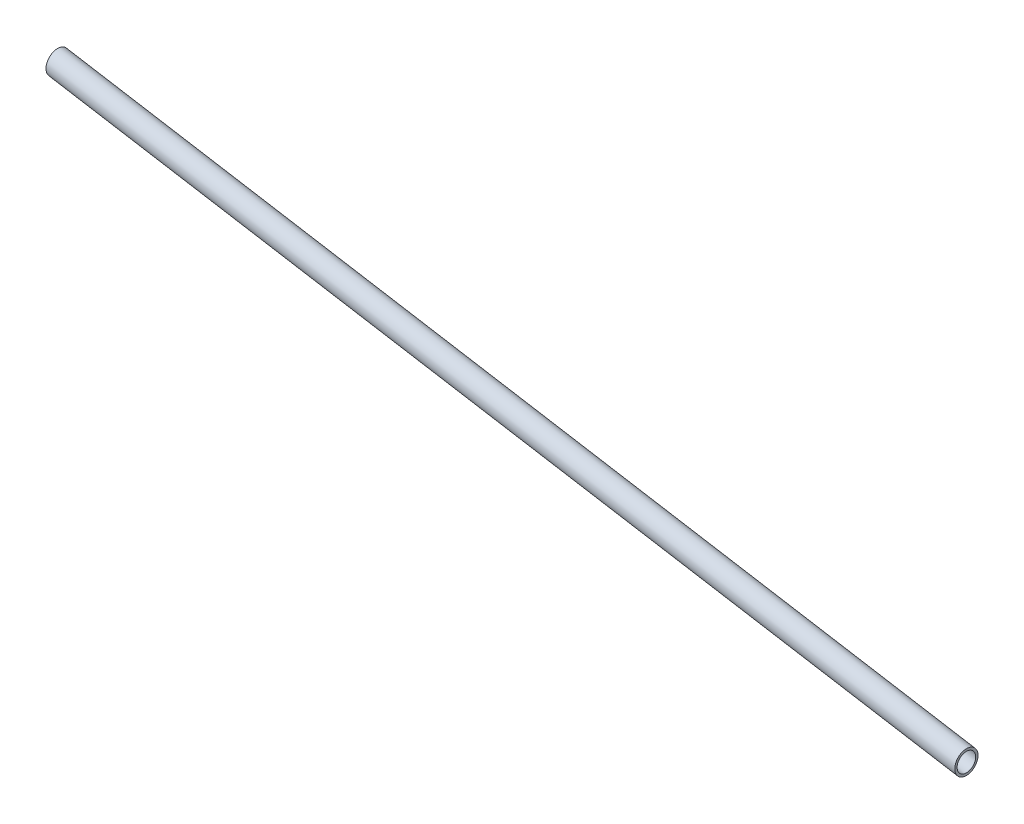
ISO-10303-21;
HEADER;
FILE_DESCRIPTION(('STEP AP214'),'2;1');
FILE_NAME('part.step','',(''),(''),'','','');
FILE_SCHEMA(('AUTOMOTIVE_DESIGN { 1 0 10303 214 1 1 1 1 }'));
ENDSEC;
DATA;
#1=APPLICATION_CONTEXT('core data for automotive mechanical design processes');
#2=APPLICATION_PROTOCOL_DEFINITION('international standard','automotive_design',2000,#1);
#3=PRODUCT_CONTEXT('',#1,'mechanical');
#4=PRODUCT('Part','Part','',(#3));
#5=PRODUCT_RELATED_PRODUCT_CATEGORY('part','',(#4));
#6=PRODUCT_DEFINITION_FORMATION('','',#4);
#7=PRODUCT_DEFINITION_CONTEXT('part definition',#1,'design');
#8=PRODUCT_DEFINITION('design','',#6,#7);
#9=PRODUCT_DEFINITION_SHAPE('','',#8);
#10=(LENGTH_UNIT() NAMED_UNIT(*) SI_UNIT(.MILLI.,.METRE.));
#11=(NAMED_UNIT(*) PLANE_ANGLE_UNIT() SI_UNIT($,.RADIAN.));
#12=(NAMED_UNIT(*) SI_UNIT($,.STERADIAN.) SOLID_ANGLE_UNIT());
#13=UNCERTAINTY_MEASURE_WITH_UNIT(LENGTH_MEASURE(1.E-05),#10,'distance_accuracy_value','');
#14=(GEOMETRIC_REPRESENTATION_CONTEXT(3) GLOBAL_UNCERTAINTY_ASSIGNED_CONTEXT((#13)) GLOBAL_UNIT_ASSIGNED_CONTEXT((#10,
#11,#12)) REPRESENTATION_CONTEXT('',''));
#15=CARTESIAN_POINT('',(0.,0.,0.));
#16=DIRECTION('',(0.,0.,1.));
#17=DIRECTION('',(1.,0.,0.));
#18=AXIS2_PLACEMENT_3D('',#15,#16,#17);
#19=CARTESIAN_POINT('',(900.,-13.3527483768346,117.528566468452));
#20=DIRECTION('',(1.,0.,0.));
#21=DIRECTION('',(0.,0.,1.));
#22=AXIS2_PLACEMENT_3D('',#19,#20,#21);
#23=PLANE('',#22);
#24=CARTESIAN_POINT('',(900.,-13.6611981228931,125.522617929017));
#25=CARTESIAN_POINT('',(899.999999999999,-14.3273690779402,125.496913783512));
#26=CARTESIAN_POINT('',(900.,-15.077816038196,125.386830865983));
#27=CARTESIAN_POINT('',(900.,-16.2918837939154,124.981319479555));
#28=CARTESIAN_POINT('',(900.,-16.7105159653835,124.805600335317));
#29=CARTESIAN_POINT('',(900.,-17.5555198140543,124.352534326282));
#30=CARTESIAN_POINT('',(899.999999999999,-17.9819276286325,124.074950500815));
#31=CARTESIAN_POINT('',(900.,-18.809950471408,123.402525077723));
#32=CARTESIAN_POINT('',(900.,-19.2114321716608,123.007383410496));
#33=CARTESIAN_POINT('',(900.,-19.9455280927444,122.097687446241));
#34=CARTESIAN_POINT('',(900.,-20.277770524181,121.582917586888));
#35=CARTESIAN_POINT('',(900.,-20.825181509128,120.453705408092));
#36=CARTESIAN_POINT('',(900.,-21.0398273173365,119.839343780789));
#37=CARTESIAN_POINT('',(900.,-21.3136829117945,118.555404213572));
#38=CARTESIAN_POINT('',(900.,-21.3725039829041,117.886287677441));
#39=CARTESIAN_POINT('',(900.,-21.3210956918944,116.553945767347));
#40=CARTESIAN_POINT('',(900.,-21.2108906650607,115.891351087779));
#41=CARTESIAN_POINT('',(900.,-20.8389151987204,114.632330853103));
#42=CARTESIAN_POINT('',(900.,-20.5775678721537,114.036335377466));
#43=CARTESIAN_POINT('',(900.,-19.9447728744568,112.952661338804));
#44=CARTESIAN_POINT('',(900.,-19.573852612162,112.465022947816));
#45=CARTESIAN_POINT('',(900.,-18.7718425667194,111.614597492093));
#46=CARTESIAN_POINT('',(900.,-18.341106857399,111.251566857665));
#47=CARTESIAN_POINT('',(900.,-17.4637320552541,110.644944047066));
#48=CARTESIAN_POINT('',(900.,-17.0172027720756,110.40104241985));
#49=CARTESIAN_POINT('',(899.999999999999,-16.1398002125449,110.014435304887));
#50=CARTESIAN_POINT('',(900.,-15.7088726472318,109.87149634556));
#51=CARTESIAN_POINT('',(899.999999999999,-14.4671677942657,109.560740721121));
#52=CARTESIAN_POINT('',(900.,-13.7104695858231,109.508810862383));
#53=CARTESIAN_POINT('',(899.999999999999,-12.3781276757289,109.560219153392));
#54=CARTESIAN_POINT('',(900.,-11.6276807154731,109.670302070921));
#55=CARTESIAN_POINT('',(900.,-10.4136129597538,110.075813457349));
#56=CARTESIAN_POINT('',(900.,-9.99498078828561,110.251532601588));
#57=CARTESIAN_POINT('',(899.999999999999,-9.1499769396148,110.704598610623));
#58=CARTESIAN_POINT('',(900.,-8.72356912503667,110.98218243609));
#59=CARTESIAN_POINT('',(899.999999999999,-7.89554628226113,111.654607859181));
#60=CARTESIAN_POINT('',(899.999999999999,-7.49406458200832,112.049749526409));
#61=CARTESIAN_POINT('',(900.,-6.75996866092468,112.959445490663));
#62=CARTESIAN_POINT('',(900.,-6.42772622948817,113.474215350017));
#63=CARTESIAN_POINT('',(899.999999999999,-5.88031524454111,114.603427528812));
#64=CARTESIAN_POINT('',(900.,-5.66566943633261,115.217789156115));
#65=CARTESIAN_POINT('',(900.,-5.39181384187462,116.501728723333));
#66=CARTESIAN_POINT('',(900.,-5.33299277076501,117.170845259464));
#67=CARTESIAN_POINT('',(900.,-5.38440106177477,118.503187169558));
#68=CARTESIAN_POINT('',(900.,-5.49460608860846,119.165781849125));
#69=CARTESIAN_POINT('',(900.,-5.86658155494875,120.424802083801));
#70=CARTESIAN_POINT('',(900.,-6.12792888151546,121.020797559439));
#71=CARTESIAN_POINT('',(900.,-6.76072387921231,122.104471598101));
#72=CARTESIAN_POINT('',(900.,-7.13164414150718,122.592109989088));
#73=CARTESIAN_POINT('',(900.,-7.93365418694975,123.442535444812));
#74=CARTESIAN_POINT('',(899.999999999999,-8.36438989627016,123.80556607924));
#75=CARTESIAN_POINT('',(900.,-9.24176469841508,124.412188889839));
#76=CARTESIAN_POINT('',(899.999999999999,-9.68829398159356,124.656090517054));
#77=CARTESIAN_POINT('',(899.999999999999,-10.5656965411242,125.042697632018));
#78=CARTESIAN_POINT('',(900.,-10.9966241064373,125.185636591345));
#79=CARTESIAN_POINT('',(900.,-12.2383289594035,125.496392215783));
#80=CARTESIAN_POINT('',(900.,-12.9950271678461,125.548322074522));
#81=CARTESIAN_POINT('',(900.,-13.6611981228931,125.522617929017));
#82=B_SPLINE_CURVE_WITH_KNOTS('',3,(#24,#25,#26,#27,#28,#29,#30,#31,#32,#33,#34,#35,#36,#37,#38,
#39,#40,#41,#42,#43,#44,#45,#46,#47,#48,#49,#50,#51,#52,#53,#54,#55,#56,#57,#58,#59,#60,#61,#62,
#63,#64,#65,#66,#67,#68,#69,#70,#71,#72,#73,#74,#75,#76,#77,#78,#79,#80,#81),.UNSPECIFIED.,.T.,
.F.,(4,2,2,2,2,2,2,2,2,2,2,2,2,2,2,2,2,2,2,2,2,2,2,2,2,2,2,2,4),(0.,0.0624999999999998,
0.0937499999999998,0.125,0.15625,0.1875,0.21875,0.25,0.28125,0.3125,0.34375,0.374999999999999,
0.406249999999999,0.437499999999999,0.499999999999999,0.562499999999999,0.593749999999999,
0.624999999999999,0.656249999999999,0.687499999999999,0.71875,0.75,0.78125,0.8125,0.84375,0.875,
0.90625,0.9375,1.),.UNSPECIFIED.);
#83=CARTESIAN_POINT('',(900.,-13.6611981228931,125.522617929017));
#84=VERTEX_POINT('',#83);
#85=EDGE_CURVE('E53',#84,#84,#82,.F.);
#86=ORIENTED_EDGE('',*,*,#85,.T.);
#87=EDGE_LOOP('',(#86));
#88=FACE_BOUND('',#87,.T.);
#89=CARTESIAN_POINT('',(900.,-13.3527483768346,127.528566468452));
#90=CARTESIAN_POINT('',(900.,-12.9360817101679,127.528566468452));
#91=CARTESIAN_POINT('',(900.,-12.4931143673846,127.502722627901));
#92=CARTESIAN_POINT('',(900.,-11.5575151296474,127.377419158561));
#93=CARTESIAN_POINT('',(900.,-11.0647483768346,127.277899801786));
#94=CARTESIAN_POINT('',(900.,-10.0407483768346,126.979233135119));
#95=CARTESIAN_POINT('',(900.,-9.50937843196229,126.779923620327));
#96=CARTESIAN_POINT('',(899.999999999999,-8.43207337788663,126.254737406465));
#97=CARTESIAN_POINT('',(900.,-7.8860817101679,125.928566468452));
#98=CARTESIAN_POINT('',(899.999999999999,-6.81941504350124,125.128566468452));
#99=CARTESIAN_POINT('',(900.,-6.29889211862478,124.654356172587));
#100=CARTESIAN_POINT('',(899.999999999999,-5.33811148435944,123.553461695824));
#101=CARTESIAN_POINT('',(900.,-4.89830777706525,122.926490343885));
#102=CARTESIAN_POINT('',(899.999999999999,-4.16013015307448,121.542407298902));
#103=CARTESIAN_POINT('',(900.,-3.86241307111466,120.78537120218));
#104=CARTESIAN_POINT('',(900.,-3.45846829793911,119.194838657801));
#105=CARTESIAN_POINT('',(900.,-3.35274837683457,118.361899801786));
#106=CARTESIAN_POINT('',(900.,-3.35274837683457,116.695233135119));
#107=CARTESIAN_POINT('',(900.,-3.45846829793911,115.862294279103));
#108=CARTESIAN_POINT('',(900.,-3.86241307111466,114.271761734724));
#109=CARTESIAN_POINT('',(900.,-4.16013015307448,113.514725638003));
#110=CARTESIAN_POINT('',(899.999999999999,-4.89830777706525,112.13064259302));
#111=CARTESIAN_POINT('',(900.,-5.33811148435943,111.50367124108));
#112=CARTESIAN_POINT('',(900.,-6.29889211862478,110.402776764318));
#113=CARTESIAN_POINT('',(900.,-6.81941504350124,109.928566468452));
#114=CARTESIAN_POINT('',(899.999999999999,-7.8860817101679,109.128566468452));
#115=CARTESIAN_POINT('',(900.,-8.43207337788662,108.802395530439));
#116=CARTESIAN_POINT('',(899.999999999999,-9.50937843196229,108.277209316577));
#117=CARTESIAN_POINT('',(900.,-10.0407483768346,108.077899801786));
#118=CARTESIAN_POINT('',(900.,-11.0647483768346,107.779233135119));
#119=CARTESIAN_POINT('',(900.,-11.5575151296474,107.679713778343));
#120=CARTESIAN_POINT('',(899.999999999999,-12.4931143673846,107.554410309004));
#121=CARTESIAN_POINT('',(900.,-12.9360817101679,107.528566468452));
#122=CARTESIAN_POINT('',(900.,-13.7694150435012,107.528566468452));
#123=CARTESIAN_POINT('',(900.,-14.2123823862845,107.554410309004));
#124=CARTESIAN_POINT('',(900.,-15.1479816240218,107.679713778343));
#125=CARTESIAN_POINT('',(900.,-15.6407483768346,107.779233135119));
#126=CARTESIAN_POINT('',(900.,-16.6647483768346,108.077899801786));
#127=CARTESIAN_POINT('',(899.999999999999,-17.1961183217068,108.277209316577));
#128=CARTESIAN_POINT('',(900.,-18.2734233757825,108.802395530439));
#129=CARTESIAN_POINT('',(900.,-18.8194150435012,109.128566468452));
#130=CARTESIAN_POINT('',(900.,-19.8860817101679,109.928566468452));
#131=CARTESIAN_POINT('',(900.,-20.4066046350444,110.402776764318));
#132=CARTESIAN_POINT('',(900.,-21.3673852693097,111.50367124108));
#133=CARTESIAN_POINT('',(900.,-21.8071889766039,112.13064259302));
#134=CARTESIAN_POINT('',(900.,-22.5453666005947,113.514725638002));
#135=CARTESIAN_POINT('',(899.999999999999,-22.8430836825545,114.271761734724));
#136=CARTESIAN_POINT('',(899.999999999999,-23.24702845573,115.862294279103));
#137=CARTESIAN_POINT('',(900.,-23.3527483768346,116.695233135119));
#138=CARTESIAN_POINT('',(900.,-23.3527483768345,118.361899801786));
#139=CARTESIAN_POINT('',(900.,-23.24702845573,119.194838657801));
#140=CARTESIAN_POINT('',(900.,-22.8430836825545,120.78537120218));
#141=CARTESIAN_POINT('',(899.999999999999,-22.5453666005947,121.542407298902));
#142=CARTESIAN_POINT('',(900.,-21.8071889766039,122.926490343885));
#143=CARTESIAN_POINT('',(900.,-21.3673852693097,123.553461695825));
#144=CARTESIAN_POINT('',(900.,-20.4066046350444,124.654356172587));
#145=CARTESIAN_POINT('',(900.,-19.8860817101679,125.128566468452));
#146=CARTESIAN_POINT('',(900.,-18.8194150435012,125.928566468452));
#147=CARTESIAN_POINT('',(900.,-18.2734233757825,126.254737406465));
#148=CARTESIAN_POINT('',(900.,-17.1961183217068,126.779923620327));
#149=CARTESIAN_POINT('',(900.000000000001,-16.6647483768346,126.979233135119));
#150=CARTESIAN_POINT('',(900.,-15.6407483768346,127.277899801786));
#151=CARTESIAN_POINT('',(900.,-15.1479816240218,127.377419158561));
#152=CARTESIAN_POINT('',(900.,-14.2123823862845,127.502722627901));
#153=CARTESIAN_POINT('',(900.,-13.7694150435012,127.528566468452));
#154=CARTESIAN_POINT('',(900.,-13.3527483768346,127.528566468452));
#155=B_SPLINE_CURVE_WITH_KNOTS('',3,(#89,#90,#91,#92,#93,#94,#95,#96,#97,#98,#99,#100,#101,#102,
#103,#104,#105,#106,#107,#108,#109,#110,#111,#112,#113,#114,#115,#116,#117,#118,#119,#120,#121,
#122,#123,#124,#125,#126,#127,#128,#129,#130,#131,#132,#133,#134,#135,#136,#137,#138,#139,#140,
#141,#142,#143,#144,#145,#146,#147,#148,#149,#150,#151,#152,#153,#154),.UNSPECIFIED.,.T.,.F.,(4,
2,2,2,2,2,2,2,2,2,2,2,2,2,2,2,2,2,2,2,2,2,2,2,2,2,2,2,2,2,2,2,4),(0.,0.03125,0.0625,0.09375,
0.125,0.15625,0.1875,0.21875,0.25,0.28125,0.3125,0.34375,0.375,0.40625,0.4375,0.46875,0.5,
0.53125,0.5625,0.59375,0.625,0.65625,0.6875,0.71875,0.75,0.78125,0.8125,0.84375,0.875,0.90625,
0.9375,0.96875,1.),.UNSPECIFIED.);
#156=CARTESIAN_POINT('',(900.,-13.3527483768346,127.528566468452));
#157=VERTEX_POINT('',#156);
#158=EDGE_CURVE('E10',#157,#157,#155,.T.);
#159=ORIENTED_EDGE('',*,*,#158,.F.);
#160=EDGE_LOOP('',(#159));
#161=FACE_BOUND('',#160,.T.);
#162=ADVANCED_FACE('F39',(#88,#161),#23,.T.);
#163=CARTESIAN_POINT('',(0.,0.,0.));
#164=DIRECTION('',(1.,0.,0.));
#165=DIRECTION('',(0.,0.,1.));
#166=AXIS2_PLACEMENT_3D('',#163,#164,#165);
#167=PLANE('',#166);
#168=CARTESIAN_POINT('',(0.,0.04684620258965,7.9998628384056));
#169=CARTESIAN_POINT('',(0.,0.71350143912345,7.9959589881898));
#170=CARTESIAN_POINT('',(0.,1.46714713450424,7.91047767606317));
#171=CARTESIAN_POINT('',(0.,2.69382735660733,7.54488824418483));
#172=CARTESIAN_POINT('',(0.,3.11798233475947,7.38295409970364));
#173=CARTESIAN_POINT('',(0.,3.97735130355492,6.95776556707056));
#174=CARTESIAN_POINT('',(0.,4.41260916183703,6.69427552684503));
#175=CARTESIAN_POINT('',(0.,5.26218016839313,6.04928957149636));
#176=CARTESIAN_POINT('',(0.,5.67636987355985,5.66748938690894));
#177=CARTESIAN_POINT('',(0.,6.43982393018292,4.78228801311951));
#178=CARTESIAN_POINT('',(0.,6.78872374090341,4.27865921784961));
#179=CARTESIAN_POINT('',(0.,7.37277181166143,3.16795368431511));
#180=CARTESIAN_POINT('',(0.,7.60739496705886,2.56094049909171));
#181=CARTESIAN_POINT('',(0.,7.92309420404844,1.2866439517188));
#182=CARTESIAN_POINT('',(0.,8.00376668862141,0.619809033944151));
#183=CARTESIAN_POINT('',(0.,7.99595898818979,-0.71350143912345));
#184=CARTESIAN_POINT('',(0.,7.90748249913809,-1.37934584152974));
#185=CARTESIAN_POINT('',(0.,7.57688118018863,-2.6498577331668));
#186=CARTESIAN_POINT('',(0.,7.33516517152026,-3.25408153544302));
#187=CARTESIAN_POINT('',(0.,6.73814929381701,-4.3578709052734));
#188=CARTESIAN_POINT('',(0.,6.38337523770235,-4.85737907382898));
#189=CARTESIAN_POINT('',(0.,5.60960663594162,-5.73357866277101));
#190=CARTESIAN_POINT('',(0.,5.19097394045686,-6.11050194288017));
#191=CARTESIAN_POINT('',(0.,4.33390754148642,-6.74549404167638));
#192=CARTESIAN_POINT('',(0.,3.89559370923611,-7.00386855464627));
#193=CARTESIAN_POINT('',(0.,3.03130414448628,-7.41896355711653));
#194=CARTESIAN_POINT('',(0.,2.60528178755254,-7.57591916878022));
#195=CARTESIAN_POINT('',(0.,1.37440414569743,-7.92711744722302));
#196=CARTESIAN_POINT('',(0.,0.619809033944149,-8.00376668862141));
#197=CARTESIAN_POINT('',(0.,-0.713501439123451,-7.9959589881898));
#198=CARTESIAN_POINT('',(0.,-1.46714713450424,-7.91047767606317));
#199=CARTESIAN_POINT('',(0.,-2.69382735660733,-7.54488824418483));
#200=CARTESIAN_POINT('',(0.,-3.11798233475947,-7.38295409970363));
#201=CARTESIAN_POINT('',(0.,-3.97735130355492,-6.95776556707056));
#202=CARTESIAN_POINT('',(0.,-4.41260916183704,-6.69427552684504));
#203=CARTESIAN_POINT('',(0.,-5.26218016839313,-6.04928957149635));
#204=CARTESIAN_POINT('',(0.,-5.67636987355985,-5.66748938690893));
#205=CARTESIAN_POINT('',(0.,-6.43982393018293,-4.78228801311951));
#206=CARTESIAN_POINT('',(0.,-6.78872374090342,-4.27865921784961));
#207=CARTESIAN_POINT('',(0.,-7.37277181166143,-3.16795368431511));
#208=CARTESIAN_POINT('',(0.,-7.60739496705886,-2.56094049909171));
#209=CARTESIAN_POINT('',(0.,-7.92309420404844,-1.2866439517188));
#210=CARTESIAN_POINT('',(0.,-8.00376668862141,-0.619809033944147));
#211=CARTESIAN_POINT('',(0.,-7.9959589881898,0.71350143912345));
#212=CARTESIAN_POINT('',(0.,-7.90748249913809,1.37934584152974));
#213=CARTESIAN_POINT('',(0.,-7.57688118018863,2.6498577331668));
#214=CARTESIAN_POINT('',(0.,-7.33516517152026,3.25408153544302));
#215=CARTESIAN_POINT('',(0.,-6.73814929381701,4.3578709052734));
#216=CARTESIAN_POINT('',(0.,-6.38337523770235,4.85737907382898));
#217=CARTESIAN_POINT('',(0.,-5.60960663594162,5.73357866277101));
#218=CARTESIAN_POINT('',(0.,-5.19097394045686,6.11050194288017));
#219=CARTESIAN_POINT('',(0.,-4.33390754148642,6.74549404167638));
#220=CARTESIAN_POINT('',(0.,-3.89559370923611,7.00386855464627));
#221=CARTESIAN_POINT('',(0.,-3.03130414448628,7.41896355711653));
#222=CARTESIAN_POINT('',(0.,-2.60528178755255,7.57591916878021));
#223=CARTESIAN_POINT('',(0.,-1.37440414569742,7.92711744722302));
#224=CARTESIAN_POINT('',(0.,-0.619809033944146,8.0037666886214));
#225=CARTESIAN_POINT('',(0.,0.0468462025896497,7.9998628384056));
#226=B_SPLINE_CURVE_WITH_KNOTS('',3,(#168,#169,#170,#171,#172,#173,#174,#175,#176,#177,#178,
#179,#180,#181,#182,#183,#184,#185,#186,#187,#188,#189,#190,#191,#192,#193,#194,#195,#196,#197,
#198,#199,#200,#201,#202,#203,#204,#205,#206,#207,#208,#209,#210,#211,#212,#213,#214,#215,#216,
#217,#218,#219,#220,#221,#222,#223,#224,#225),.UNSPECIFIED.,.T.,.F.,(4,2,2,2,2,2,2,2,2,2,2,2,2,
2,2,2,2,2,2,2,2,2,2,2,2,2,2,2,4),(0.,0.0625000000000002,0.0937500000000002,0.125,0.15625,0.1875,
0.21875,0.25,0.28125,0.312500000000001,0.343750000000001,0.375000000000001,0.406250000000001,
0.437500000000001,0.500000000000001,0.562500000000001,0.593750000000001,0.625000000000001,
0.65625,0.6875,0.71875,0.75,0.78125,0.8125,0.84375,0.875,0.90625,0.9375,1.),.UNSPECIFIED.);
#227=CARTESIAN_POINT('',(0.,0.04684620258965,7.9998628384056));
#228=VERTEX_POINT('',#227);
#229=EDGE_CURVE('E58',#228,#228,#226,.F.);
#230=ORIENTED_EDGE('',*,*,#229,.T.);
#231=EDGE_LOOP('',(#230));
#232=FACE_BOUND('',#231,.T.);
#233=CARTESIAN_POINT('',(0.,0.,10.));
#234=CARTESIAN_POINT('',(0.,-0.416666666666666,10.));
#235=CARTESIAN_POINT('',(0.,-0.85963400944997,9.97415615944867));
#236=CARTESIAN_POINT('',(0.,-1.7952332471872,9.84885269010886));
#237=CARTESIAN_POINT('',(0.,-2.288,9.74933333333334));
#238=CARTESIAN_POINT('',(0.,-3.312,9.45066666666666));
#239=CARTESIAN_POINT('',(0.,-3.84336994487228,9.25135715187476));
#240=CARTESIAN_POINT('',(0.,-4.92067499894794,8.72617093801288));
#241=CARTESIAN_POINT('',(0.,-5.46666666666667,8.4));
#242=CARTESIAN_POINT('',(0.,-6.53333333333333,7.6));
#243=CARTESIAN_POINT('',(0.,-7.05385625820979,7.12578970413461));
#244=CARTESIAN_POINT('',(0.,-8.01463689247514,6.02489522737224));
#245=CARTESIAN_POINT('',(0.,-8.45444059976932,5.39792387543252));
#246=CARTESIAN_POINT('',(0.,-9.19261822376009,4.01384083044983));
#247=CARTESIAN_POINT('',(0.,-9.49033530571992,3.25680473372781));
#248=CARTESIAN_POINT('',(0.,-9.89428007889547,1.66627218934911));
#249=CARTESIAN_POINT('',(0.,-10.,0.833333333333334));
#250=CARTESIAN_POINT('',(0.,-10.,-0.833333333333333));
#251=CARTESIAN_POINT('',(0.,-9.89428007889546,-1.66627218934911));
#252=CARTESIAN_POINT('',(0.,-9.49033530571992,-3.25680473372781));
#253=CARTESIAN_POINT('',(0.,-9.19261822376009,-4.01384083044983));
#254=CARTESIAN_POINT('',(0.,-8.45444059976932,-5.39792387543253));
#255=CARTESIAN_POINT('',(0.,-8.01463689247514,-6.02489522737224));
#256=CARTESIAN_POINT('',(0.,-7.05385625820979,-7.12578970413462));
#257=CARTESIAN_POINT('',(0.,-6.53333333333333,-7.6));
#258=CARTESIAN_POINT('',(0.,-5.46666666666667,-8.4));
#259=CARTESIAN_POINT('',(0.,-4.92067499894794,-8.72617093801288));
#260=CARTESIAN_POINT('',(0.,-3.84336994487228,-9.25135715187477));
#261=CARTESIAN_POINT('',(0.,-3.312,-9.45066666666667));
#262=CARTESIAN_POINT('',(0.,-2.288,-9.74933333333334));
#263=CARTESIAN_POINT('',(0.,-1.7952332471872,-9.84885269010886));
#264=CARTESIAN_POINT('',(0.,-0.859634009449969,-9.97415615944867));
#265=CARTESIAN_POINT('',(0.,-0.416666666666665,-10.));
#266=CARTESIAN_POINT('',(0.,0.416666666666668,-10.));
#267=CARTESIAN_POINT('',(0.,0.859634009449971,-9.97415615944867));
#268=CARTESIAN_POINT('',(0.,1.7952332471872,-9.84885269010886));
#269=CARTESIAN_POINT('',(0.,2.288,-9.74933333333334));
#270=CARTESIAN_POINT('',(0.,3.312,-9.45066666666667));
#271=CARTESIAN_POINT('',(0.,3.84336994487228,-9.25135715187476));
#272=CARTESIAN_POINT('',(0.,4.92067499894794,-8.72617093801288));
#273=CARTESIAN_POINT('',(0.,5.46666666666667,-8.4));
#274=CARTESIAN_POINT('',(0.,6.53333333333334,-7.6));
#275=CARTESIAN_POINT('',(0.,7.0538562582098,-7.12578970413461));
#276=CARTESIAN_POINT('',(0.,8.01463689247513,-6.02489522737224));
#277=CARTESIAN_POINT('',(0.,8.45444059976932,-5.39792387543252));
#278=CARTESIAN_POINT('',(0.,9.19261822376009,-4.01384083044983));
#279=CARTESIAN_POINT('',(0.,9.49033530571992,-3.25680473372781));
#280=CARTESIAN_POINT('',(0.,9.89428007889547,-1.66627218934911));
#281=CARTESIAN_POINT('',(0.,9.99999999999999,-0.833333333333334));
#282=CARTESIAN_POINT('',(0.,10.,0.833333333333337));
#283=CARTESIAN_POINT('',(0.,9.89428007889546,1.66627218934911));
#284=CARTESIAN_POINT('',(0.,9.49033530571992,3.25680473372781));
#285=CARTESIAN_POINT('',(0.,9.19261822376009,4.01384083044983));
#286=CARTESIAN_POINT('',(0.,8.45444059976932,5.39792387543253));
#287=CARTESIAN_POINT('',(0.,8.01463689247513,6.02489522737224));
#288=CARTESIAN_POINT('',(0.,7.05385625820979,7.12578970413461));
#289=CARTESIAN_POINT('',(0.,6.53333333333333,7.6));
#290=CARTESIAN_POINT('',(0.,5.46666666666667,8.4));
#291=CARTESIAN_POINT('',(0.,4.92067499894794,8.72617093801288));
#292=CARTESIAN_POINT('',(0.,3.84336994487228,9.25135715187476));
#293=CARTESIAN_POINT('',(0.,3.312,9.45066666666667));
#294=CARTESIAN_POINT('',(0.,2.288,9.74933333333333));
#295=CARTESIAN_POINT('',(0.,1.7952332471872,9.84885269010886));
#296=CARTESIAN_POINT('',(0.,0.859634009449971,9.97415615944867));
#297=CARTESIAN_POINT('',(0.,0.416666666666666,10.));
#298=CARTESIAN_POINT('',(0.,0.,10.));
#299=B_SPLINE_CURVE_WITH_KNOTS('',3,(#233,#234,#235,#236,#237,#238,#239,#240,#241,#242,#243,
#244,#245,#246,#247,#248,#249,#250,#251,#252,#253,#254,#255,#256,#257,#258,#259,#260,#261,#262,
#263,#264,#265,#266,#267,#268,#269,#270,#271,#272,#273,#274,#275,#276,#277,#278,#279,#280,#281,
#282,#283,#284,#285,#286,#287,#288,#289,#290,#291,#292,#293,#294,#295,#296,#297,#298),
.UNSPECIFIED.,.T.,.F.,(4,2,2,2,2,2,2,2,2,2,2,2,2,2,2,2,2,2,2,2,2,2,2,2,2,2,2,2,2,2,2,2,4),(0.,
0.03125,0.0625,0.09375,0.125,0.15625,0.1875,0.21875,0.25,0.28125,0.3125,0.34375,0.375,0.40625,
0.4375,0.46875,0.5,0.53125,0.5625,0.59375,0.625,0.65625,0.6875,0.71875,0.75,0.78125,0.8125,
0.84375,0.875,0.90625,0.9375,0.96875,1.),.UNSPECIFIED.);
#300=CARTESIAN_POINT('',(0.,0.,10.));
#301=VERTEX_POINT('',#300);
#302=EDGE_CURVE('E48',#301,#301,#299,.F.);
#303=ORIENTED_EDGE('',*,*,#302,.T.);
#304=EDGE_LOOP('',(#303));
#305=FACE_BOUND('',#304,.T.);
#306=ADVANCED_FACE('F65',(#232,#305),#167,.F.);
#307=CARTESIAN_POINT('',(0.,0.,10.));
#308=CARTESIAN_POINT('',(900.,-13.3527483768346,127.528566468452));
#309=CARTESIAN_POINT('',(0.,0.416666666666666,10.));
#310=CARTESIAN_POINT('',(900.,-12.9360817101679,127.528566468452));
#311=CARTESIAN_POINT('',(0.,0.859634009449971,9.97415615944867));
#312=CARTESIAN_POINT('',(900.,-12.4931143673846,127.502722627901));
#313=CARTESIAN_POINT('',(0.,1.7952332471872,9.84885269010886));
#314=CARTESIAN_POINT('',(900.,-11.5575151296474,127.377419158561));
#315=CARTESIAN_POINT('',(0.,2.288,9.74933333333333));
#316=CARTESIAN_POINT('',(900.000000000001,-11.0647483768346,127.277899801786));
#317=CARTESIAN_POINT('',(0.,3.312,9.45066666666667));
#318=CARTESIAN_POINT('',(900.,-10.0407483768346,126.979233135119));
#319=CARTESIAN_POINT('',(0.,3.84336994487228,9.25135715187476));
#320=CARTESIAN_POINT('',(900.,-9.5093784319623,126.779923620327));
#321=CARTESIAN_POINT('',(0.,4.92067499894794,8.72617093801288));
#322=CARTESIAN_POINT('',(900.,-8.43207337788663,126.254737406465));
#323=CARTESIAN_POINT('',(0.,5.46666666666667,8.4));
#324=CARTESIAN_POINT('',(900.,-7.88608171016791,125.928566468452));
#325=CARTESIAN_POINT('',(0.,6.53333333333333,7.6));
#326=CARTESIAN_POINT('',(900.,-6.81941504350124,125.128566468452));
#327=CARTESIAN_POINT('',(0.,7.05385625820979,7.12578970413461));
#328=CARTESIAN_POINT('',(900.,-6.29889211862478,124.654356172587));
#329=CARTESIAN_POINT('',(0.,8.01463689247513,6.02489522737224));
#330=CARTESIAN_POINT('',(900.,-5.33811148435944,123.553461695825));
#331=CARTESIAN_POINT('',(0.,8.45444059976932,5.39792387543253));
#332=CARTESIAN_POINT('',(900.,-4.89830777706526,122.926490343885));
#333=CARTESIAN_POINT('',(0.,9.19261822376009,4.01384083044983));
#334=CARTESIAN_POINT('',(900.,-4.16013015307449,121.542407298902));
#335=CARTESIAN_POINT('',(0.,9.49033530571992,3.25680473372781));
#336=CARTESIAN_POINT('',(900.,-3.86241307111466,120.78537120218));
#337=CARTESIAN_POINT('',(0.,9.89428007889546,1.66627218934911));
#338=CARTESIAN_POINT('',(900.,-3.45846829793912,119.194838657801));
#339=CARTESIAN_POINT('',(0.,10.,0.833333333333337));
#340=CARTESIAN_POINT('',(900.,-3.35274837683458,118.361899801786));
#341=CARTESIAN_POINT('',(0.,9.99999999999999,-0.833333333333334));
#342=CARTESIAN_POINT('',(900.,-3.35274837683458,116.695233135119));
#343=CARTESIAN_POINT('',(0.,9.89428007889547,-1.66627218934911));
#344=CARTESIAN_POINT('',(900.,-3.45846829793911,115.862294279103));
#345=CARTESIAN_POINT('',(0.,9.49033530571992,-3.25680473372781));
#346=CARTESIAN_POINT('',(900.,-3.86241307111466,114.271761734725));
#347=CARTESIAN_POINT('',(0.,9.19261822376009,-4.01384083044983));
#348=CARTESIAN_POINT('',(900.,-4.16013015307449,113.514725638003));
#349=CARTESIAN_POINT('',(0.,8.45444059976932,-5.39792387543252));
#350=CARTESIAN_POINT('',(900.,-4.89830777706526,112.13064259302));
#351=CARTESIAN_POINT('',(0.,8.01463689247513,-6.02489522737224));
#352=CARTESIAN_POINT('',(900.,-5.33811148435944,111.50367124108));
#353=CARTESIAN_POINT('',(0.,7.0538562582098,-7.12578970413461));
#354=CARTESIAN_POINT('',(900.,-6.29889211862478,110.402776764318));
#355=CARTESIAN_POINT('',(0.,6.53333333333334,-7.6));
#356=CARTESIAN_POINT('',(900.,-6.81941504350124,109.928566468452));
#357=CARTESIAN_POINT('',(0.,5.46666666666667,-8.4));
#358=CARTESIAN_POINT('',(900.,-7.88608171016791,109.128566468452));
#359=CARTESIAN_POINT('',(0.,4.92067499894794,-8.72617093801288));
#360=CARTESIAN_POINT('',(900.,-8.43207337788663,108.802395530439));
#361=CARTESIAN_POINT('',(0.,3.84336994487228,-9.25135715187476));
#362=CARTESIAN_POINT('',(900.,-9.50937843196229,108.277209316578));
#363=CARTESIAN_POINT('',(0.,3.312,-9.45066666666667));
#364=CARTESIAN_POINT('',(900.,-10.0407483768346,108.077899801786));
#365=CARTESIAN_POINT('',(0.,2.288,-9.74933333333334));
#366=CARTESIAN_POINT('',(900.,-11.0647483768346,107.779233135119));
#367=CARTESIAN_POINT('',(0.,1.7952332471872,-9.84885269010886));
#368=CARTESIAN_POINT('',(900.,-11.5575151296474,107.679713778343));
#369=CARTESIAN_POINT('',(0.,0.859634009449971,-9.97415615944867));
#370=CARTESIAN_POINT('',(900.,-12.4931143673846,107.554410309004));
#371=CARTESIAN_POINT('',(0.,0.416666666666668,-10.));
#372=CARTESIAN_POINT('',(900.,-12.9360817101679,107.528566468452));
#373=CARTESIAN_POINT('',(0.,-0.416666666666665,-10.));
#374=CARTESIAN_POINT('',(900.000000000001,-13.7694150435012,107.528566468452));
#375=CARTESIAN_POINT('',(0.,-0.859634009449969,-9.97415615944867));
#376=CARTESIAN_POINT('',(900.,-14.2123823862845,107.554410309004));
#377=CARTESIAN_POINT('',(0.,-1.7952332471872,-9.84885269010886));
#378=CARTESIAN_POINT('',(900.,-15.1479816240218,107.679713778343));
#379=CARTESIAN_POINT('',(0.,-2.288,-9.74933333333334));
#380=CARTESIAN_POINT('',(900.,-15.6407483768346,107.779233135119));
#381=CARTESIAN_POINT('',(0.,-3.312,-9.45066666666667));
#382=CARTESIAN_POINT('',(900.,-16.6647483768346,108.077899801786));
#383=CARTESIAN_POINT('',(0.,-3.84336994487228,-9.25135715187477));
#384=CARTESIAN_POINT('',(900.,-17.1961183217068,108.277209316578));
#385=CARTESIAN_POINT('',(0.,-4.92067499894794,-8.72617093801288));
#386=CARTESIAN_POINT('',(900.,-18.2734233757825,108.802395530439));
#387=CARTESIAN_POINT('',(0.,-5.46666666666667,-8.4));
#388=CARTESIAN_POINT('',(900.,-18.8194150435012,109.128566468452));
#389=CARTESIAN_POINT('',(0.,-6.53333333333333,-7.6));
#390=CARTESIAN_POINT('',(900.,-19.8860817101679,109.928566468452));
#391=CARTESIAN_POINT('',(0.,-7.05385625820979,-7.12578970413462));
#392=CARTESIAN_POINT('',(900.,-20.4066046350444,110.402776764318));
#393=CARTESIAN_POINT('',(0.,-8.01463689247514,-6.02489522737224));
#394=CARTESIAN_POINT('',(900.,-21.3673852693097,111.50367124108));
#395=CARTESIAN_POINT('',(0.,-8.45444059976932,-5.39792387543253));
#396=CARTESIAN_POINT('',(900.,-21.8071889766039,112.13064259302));
#397=CARTESIAN_POINT('',(0.,-9.19261822376009,-4.01384083044983));
#398=CARTESIAN_POINT('',(900.,-22.5453666005947,113.514725638002));
#399=CARTESIAN_POINT('',(0.,-9.49033530571992,-3.25680473372781));
#400=CARTESIAN_POINT('',(900.,-22.8430836825545,114.271761734724));
#401=CARTESIAN_POINT('',(0.,-9.89428007889546,-1.66627218934911));
#402=CARTESIAN_POINT('',(900.,-23.24702845573,115.862294279103));
#403=CARTESIAN_POINT('',(0.,-10.,-0.833333333333333));
#404=CARTESIAN_POINT('',(900.,-23.3527483768346,116.695233135119));
#405=CARTESIAN_POINT('',(0.,-10.,0.833333333333334));
#406=CARTESIAN_POINT('',(900.,-23.3527483768346,118.361899801786));
#407=CARTESIAN_POINT('',(0.,-9.89428007889547,1.66627218934911));
#408=CARTESIAN_POINT('',(900.,-23.24702845573,119.194838657801));
#409=CARTESIAN_POINT('',(0.,-9.49033530571992,3.25680473372781));
#410=CARTESIAN_POINT('',(900.,-22.8430836825545,120.78537120218));
#411=CARTESIAN_POINT('',(0.,-9.19261822376009,4.01384083044983));
#412=CARTESIAN_POINT('',(900.,-22.5453666005947,121.542407298902));
#413=CARTESIAN_POINT('',(0.,-8.45444059976932,5.39792387543252));
#414=CARTESIAN_POINT('',(900.,-21.8071889766039,122.926490343885));
#415=CARTESIAN_POINT('',(0.,-8.01463689247514,6.02489522737224));
#416=CARTESIAN_POINT('',(900.,-21.3673852693097,123.553461695825));
#417=CARTESIAN_POINT('',(0.,-7.05385625820979,7.12578970413461));
#418=CARTESIAN_POINT('',(900.,-20.4066046350444,124.654356172587));
#419=CARTESIAN_POINT('',(0.,-6.53333333333333,7.6));
#420=CARTESIAN_POINT('',(900.,-19.8860817101679,125.128566468452));
#421=CARTESIAN_POINT('',(0.,-5.46666666666667,8.4));
#422=CARTESIAN_POINT('',(900.,-18.8194150435012,125.928566468452));
#423=CARTESIAN_POINT('',(0.,-4.92067499894794,8.72617093801288));
#424=CARTESIAN_POINT('',(900.,-18.2734233757825,126.254737406465));
#425=CARTESIAN_POINT('',(0.,-3.84336994487228,9.25135715187476));
#426=CARTESIAN_POINT('',(900.,-17.1961183217069,126.779923620327));
#427=CARTESIAN_POINT('',(0.,-3.312,9.45066666666666));
#428=CARTESIAN_POINT('',(900.000000000001,-16.6647483768346,126.979233135119));
#429=CARTESIAN_POINT('',(0.,-2.288,9.74933333333334));
#430=CARTESIAN_POINT('',(900.,-15.6407483768346,127.277899801786));
#431=CARTESIAN_POINT('',(0.,-1.7952332471872,9.84885269010886));
#432=CARTESIAN_POINT('',(900.,-15.1479816240218,127.377419158561));
#433=CARTESIAN_POINT('',(0.,-0.85963400944997,9.97415615944867));
#434=CARTESIAN_POINT('',(900.,-14.2123823862845,127.502722627901));
#435=CARTESIAN_POINT('',(0.,-0.416666666666666,10.));
#436=CARTESIAN_POINT('',(900.,-13.7694150435012,127.528566468452));
#437=CARTESIAN_POINT('',(0.,0.,10.));
#438=CARTESIAN_POINT('',(900.,-13.3527483768346,127.528566468452));
#439=B_SPLINE_SURFACE_WITH_KNOTS('',3,1,((#307,#308),(#309,#310),(#311,#312),(#313,#314),(#315,
#316),(#317,#318),(#319,#320),(#321,#322),(#323,#324),(#325,#326),(#327,#328),(#329,#330),(#331,
#332),(#333,#334),(#335,#336),(#337,#338),(#339,#340),(#341,#342),(#343,#344),(#345,#346),(#347,
#348),(#349,#350),(#351,#352),(#353,#354),(#355,#356),(#357,#358),(#359,#360),(#361,#362),(#363,
#364),(#365,#366),(#367,#368),(#369,#370),(#371,#372),(#373,#374),(#375,#376),(#377,#378),(#379,
#380),(#381,#382),(#383,#384),(#385,#386),(#387,#388),(#389,#390),(#391,#392),(#393,#394),(#395,
#396),(#397,#398),(#399,#400),(#401,#402),(#403,#404),(#405,#406),(#407,#408),(#409,#410),(#411,
#412),(#413,#414),(#415,#416),(#417,#418),(#419,#420),(#421,#422),(#423,#424),(#425,#426),(#427,
#428),(#429,#430),(#431,#432),(#433,#434),(#435,#436),(#437,#438)),.UNSPECIFIED.,.T.,.F.,.F.,(4,
2,2,2,2,2,2,2,2,2,2,2,2,2,2,2,2,2,2,2,2,2,2,2,2,2,2,2,2,2,2,2,4),(2,2),(0.,0.03125,0.0625,
0.09375,0.125,0.15625,0.1875,0.21875,0.25,0.28125,0.3125,0.34375,0.375,0.40625,0.4375,0.46875,
0.5,0.53125,0.5625,0.59375,0.625,0.65625,0.6875,0.71875,0.75,0.78125,0.8125,0.84375,0.875,
0.90625,0.9375,0.96875,1.),(0.,1.),.UNSPECIFIED.);
#440=ORIENTED_EDGE('',*,*,#302,.F.);
#441=EDGE_LOOP('',(#440));
#442=FACE_BOUND('',#441,.T.);
#443=ORIENTED_EDGE('',*,*,#158,.T.);
#444=EDGE_LOOP('',(#443));
#445=FACE_BOUND('',#444,.T.);
#446=ADVANCED_FACE('F84',(#442,#445),#439,.F.);
#447=CARTESIAN_POINT('',(0.,0.04684620258965,7.9998628384056));
#448=CARTESIAN_POINT('',(900.,-13.6611981228931,125.522617929017));
#449=CARTESIAN_POINT('',(0.,0.71350143912345,7.9959589881898));
#450=CARTESIAN_POINT('',(900.,-12.9950271678461,125.548322074522));
#451=CARTESIAN_POINT('',(0.,1.46714713450424,7.91047767606317));
#452=CARTESIAN_POINT('',(900.,-12.2383289594035,125.496392215783));
#453=CARTESIAN_POINT('',(0.,2.69382735660733,7.54488824418483));
#454=CARTESIAN_POINT('',(900.,-10.9966241064373,125.185636591345));
#455=CARTESIAN_POINT('',(0.,3.11798233475947,7.38295409970364));
#456=CARTESIAN_POINT('',(900.,-10.5656965411242,125.042697632018));
#457=CARTESIAN_POINT('',(0.,3.97735130355492,6.95776556707056));
#458=CARTESIAN_POINT('',(900.,-9.68829398159356,124.656090517054));
#459=CARTESIAN_POINT('',(0.,4.41260916183703,6.69427552684503));
#460=CARTESIAN_POINT('',(900.,-9.24176469841509,124.412188889839));
#461=CARTESIAN_POINT('',(0.,5.26218016839313,6.04928957149636));
#462=CARTESIAN_POINT('',(900.,-8.36438989627017,123.80556607924));
#463=CARTESIAN_POINT('',(0.,5.67636987355985,5.66748938690894));
#464=CARTESIAN_POINT('',(900.,-7.93365418694976,123.442535444812));
#465=CARTESIAN_POINT('',(0.,6.43982393018292,4.78228801311951));
#466=CARTESIAN_POINT('',(900.,-7.13164414150718,122.592109989088));
#467=CARTESIAN_POINT('',(0.,6.78872374090341,4.27865921784961));
#468=CARTESIAN_POINT('',(900.,-6.76072387921232,122.104471598101));
#469=CARTESIAN_POINT('',(0.,7.37277181166143,3.16795368431511));
#470=CARTESIAN_POINT('',(900.,-6.12792888151547,121.020797559439));
#471=CARTESIAN_POINT('',(0.,7.60739496705886,2.56094049909171));
#472=CARTESIAN_POINT('',(900.,-5.86658155494876,120.424802083801));
#473=CARTESIAN_POINT('',(0.,7.92309420404844,1.2866439517188));
#474=CARTESIAN_POINT('',(900.,-5.49460608860847,119.165781849126));
#475=CARTESIAN_POINT('',(0.,8.00376668862141,0.619809033944151));
#476=CARTESIAN_POINT('',(900.000000000001,-5.38440106177478,118.503187169558));
#477=CARTESIAN_POINT('',(0.,7.99595898818979,-0.71350143912345));
#478=CARTESIAN_POINT('',(900.,-5.33299277076502,117.170845259464));
#479=CARTESIAN_POINT('',(0.,7.90748249913809,-1.37934584152974));
#480=CARTESIAN_POINT('',(900.,-5.39181384187463,116.501728723333));
#481=CARTESIAN_POINT('',(0.,7.57688118018863,-2.6498577331668));
#482=CARTESIAN_POINT('',(900.,-5.66566943633262,115.217789156115));
#483=CARTESIAN_POINT('',(0.,7.33516517152026,-3.25408153544302));
#484=CARTESIAN_POINT('',(900.,-5.88031524454111,114.603427528812));
#485=CARTESIAN_POINT('',(0.,6.73814929381701,-4.3578709052734));
#486=CARTESIAN_POINT('',(900.,-6.42772622948818,113.474215350017));
#487=CARTESIAN_POINT('',(0.,6.38337523770235,-4.85737907382898));
#488=CARTESIAN_POINT('',(900.,-6.75996866092469,112.959445490663));
#489=CARTESIAN_POINT('',(0.,5.60960663594162,-5.73357866277101));
#490=CARTESIAN_POINT('',(900.,-7.49406458200833,112.049749526409));
#491=CARTESIAN_POINT('',(0.,5.19097394045686,-6.11050194288017));
#492=CARTESIAN_POINT('',(900.,-7.89554628226114,111.654607859181));
#493=CARTESIAN_POINT('',(0.,4.33390754148642,-6.74549404167638));
#494=CARTESIAN_POINT('',(900.,-8.72356912503668,110.98218243609));
#495=CARTESIAN_POINT('',(0.,3.89559370923611,-7.00386855464627));
#496=CARTESIAN_POINT('',(900.,-9.1499769396148,110.704598610623));
#497=CARTESIAN_POINT('',(0.,3.03130414448628,-7.41896355711653));
#498=CARTESIAN_POINT('',(900.,-9.99498078828562,110.251532601588));
#499=CARTESIAN_POINT('',(0.,2.60528178755254,-7.57591916878022));
#500=CARTESIAN_POINT('',(900.,-10.4136129597538,110.075813457349));
#501=CARTESIAN_POINT('',(0.,1.37440414569743,-7.92711744722302));
#502=CARTESIAN_POINT('',(900.,-11.6276807154731,109.670302070921));
#503=CARTESIAN_POINT('',(0.,0.619809033944149,-8.00376668862141));
#504=CARTESIAN_POINT('',(900.,-12.3781276757289,109.560219153392));
#505=CARTESIAN_POINT('',(0.,-0.713501439123451,-7.9959589881898));
#506=CARTESIAN_POINT('',(900.,-13.7104695858231,109.508810862383));
#507=CARTESIAN_POINT('',(0.,-1.46714713450424,-7.91047767606317));
#508=CARTESIAN_POINT('',(900.,-14.4671677942657,109.560740721121));
#509=CARTESIAN_POINT('',(0.,-2.69382735660733,-7.54488824418483));
#510=CARTESIAN_POINT('',(900.,-15.7088726472318,109.87149634556));
#511=CARTESIAN_POINT('',(0.,-3.11798233475947,-7.38295409970363));
#512=CARTESIAN_POINT('',(900.,-16.1398002125449,110.014435304887));
#513=CARTESIAN_POINT('',(0.,-3.97735130355492,-6.95776556707056));
#514=CARTESIAN_POINT('',(900.,-17.0172027720756,110.40104241985));
#515=CARTESIAN_POINT('',(0.,-4.41260916183704,-6.69427552684504));
#516=CARTESIAN_POINT('',(900.,-17.4637320552541,110.644944047066));
#517=CARTESIAN_POINT('',(0.,-5.26218016839313,-6.04928957149635));
#518=CARTESIAN_POINT('',(900.,-18.341106857399,111.251566857665));
#519=CARTESIAN_POINT('',(0.,-5.67636987355985,-5.66748938690893));
#520=CARTESIAN_POINT('',(900.000000000001,-18.7718425667194,111.614597492093));
#521=CARTESIAN_POINT('',(0.,-6.43982393018293,-4.78228801311951));
#522=CARTESIAN_POINT('',(900.000000000001,-19.573852612162,112.465022947816));
#523=CARTESIAN_POINT('',(0.,-6.78872374090342,-4.27865921784961));
#524=CARTESIAN_POINT('',(900.000000000001,-19.9447728744568,112.952661338804));
#525=CARTESIAN_POINT('',(0.,-7.37277181166143,-3.16795368431511));
#526=CARTESIAN_POINT('',(900.000000000001,-20.5775678721537,114.036335377466));
#527=CARTESIAN_POINT('',(0.,-7.60739496705886,-2.56094049909171));
#528=CARTESIAN_POINT('',(900.,-20.8389151987204,114.632330853103));
#529=CARTESIAN_POINT('',(0.,-7.92309420404844,-1.2866439517188));
#530=CARTESIAN_POINT('',(900.,-21.2108906650607,115.891351087779));
#531=CARTESIAN_POINT('',(0.,-8.00376668862141,-0.619809033944147));
#532=CARTESIAN_POINT('',(900.,-21.3210956918944,116.553945767347));
#533=CARTESIAN_POINT('',(0.,-7.9959589881898,0.71350143912345));
#534=CARTESIAN_POINT('',(900.000000000001,-21.3725039829041,117.886287677441));
#535=CARTESIAN_POINT('',(0.,-7.90748249913809,1.37934584152974));
#536=CARTESIAN_POINT('',(900.000000000001,-21.3136829117945,118.555404213572));
#537=CARTESIAN_POINT('',(0.,-7.57688118018863,2.6498577331668));
#538=CARTESIAN_POINT('',(900.000000000001,-21.0398273173365,119.839343780789));
#539=CARTESIAN_POINT('',(0.,-7.33516517152026,3.25408153544302));
#540=CARTESIAN_POINT('',(900.000000000001,-20.825181509128,120.453705408092));
#541=CARTESIAN_POINT('',(0.,-6.73814929381701,4.3578709052734));
#542=CARTESIAN_POINT('',(900.000000000001,-20.277770524181,121.582917586888));
#543=CARTESIAN_POINT('',(0.,-6.38337523770235,4.85737907382898));
#544=CARTESIAN_POINT('',(900.000000000001,-19.9455280927445,122.097687446241));
#545=CARTESIAN_POINT('',(0.,-5.60960663594162,5.73357866277101));
#546=CARTESIAN_POINT('',(900.,-19.2114321716608,123.007383410496));
#547=CARTESIAN_POINT('',(0.,-5.19097394045686,6.11050194288017));
#548=CARTESIAN_POINT('',(900.,-18.809950471408,123.402525077723));
#549=CARTESIAN_POINT('',(0.,-4.33390754148642,6.74549404167638));
#550=CARTESIAN_POINT('',(900.,-17.9819276286325,124.074950500815));
#551=CARTESIAN_POINT('',(0.,-3.89559370923611,7.00386855464627));
#552=CARTESIAN_POINT('',(900.,-17.5555198140543,124.352534326282));
#553=CARTESIAN_POINT('',(0.,-3.03130414448628,7.41896355711653));
#554=CARTESIAN_POINT('',(900.,-16.7105159653835,124.805600335317));
#555=CARTESIAN_POINT('',(0.,-2.60528178755255,7.57591916878021));
#556=CARTESIAN_POINT('',(900.,-16.2918837939154,124.981319479555));
#557=CARTESIAN_POINT('',(0.,-1.37440414569742,7.92711744722302));
#558=CARTESIAN_POINT('',(900.,-15.077816038196,125.386830865983));
#559=CARTESIAN_POINT('',(0.,-0.619809033944146,8.0037666886214));
#560=CARTESIAN_POINT('',(900.,-14.3273690779402,125.496913783512));
#561=CARTESIAN_POINT('',(0.,0.04684620258965,7.9998628384056));
#562=CARTESIAN_POINT('',(900.,-13.6611981228931,125.522617929017));
#563=B_SPLINE_SURFACE_WITH_KNOTS('',3,1,((#447,#448),(#449,#450),(#451,#452),(#453,#454),(#455,
#456),(#457,#458),(#459,#460),(#461,#462),(#463,#464),(#465,#466),(#467,#468),(#469,#470),(#471,
#472),(#473,#474),(#475,#476),(#477,#478),(#479,#480),(#481,#482),(#483,#484),(#485,#486),(#487,
#488),(#489,#490),(#491,#492),(#493,#494),(#495,#496),(#497,#498),(#499,#500),(#501,#502),(#503,
#504),(#505,#506),(#507,#508),(#509,#510),(#511,#512),(#513,#514),(#515,#516),(#517,#518),(#519,
#520),(#521,#522),(#523,#524),(#525,#526),(#527,#528),(#529,#530),(#531,#532),(#533,#534),(#535,
#536),(#537,#538),(#539,#540),(#541,#542),(#543,#544),(#545,#546),(#547,#548),(#549,#550),(#551,
#552),(#553,#554),(#555,#556),(#557,#558),(#559,#560),(#561,#562)),.UNSPECIFIED.,.T.,.F.,.F.,(4,
2,2,2,2,2,2,2,2,2,2,2,2,2,2,2,2,2,2,2,2,2,2,2,2,2,2,2,4),(2,2),(0.,0.0625000000000002,
0.0937500000000002,0.125,0.15625,0.1875,0.21875,0.25,0.28125,0.312500000000001,
0.343750000000001,0.375000000000001,0.406250000000001,0.437500000000001,0.500000000000001,
0.562500000000001,0.593750000000001,0.625000000000001,0.65625,0.6875,0.71875,0.75,0.78125,
0.8125,0.84375,0.875,0.90625,0.9375,1.),(0.,1.),.UNSPECIFIED.);
#564=ORIENTED_EDGE('',*,*,#229,.F.);
#565=EDGE_LOOP('',(#564));
#566=FACE_BOUND('',#565,.T.);
#567=ORIENTED_EDGE('',*,*,#85,.F.);
#568=EDGE_LOOP('',(#567));
#569=FACE_BOUND('',#568,.T.);
#570=ADVANCED_FACE('F85',(#566,#569),#563,.T.);
#571=CLOSED_SHELL('',(#162,#306,#446,#570));
#572=MANIFOLD_SOLID_BREP('B2',#571);
#573=ADVANCED_BREP_SHAPE_REPRESENTATION('',(#18,#572),#14);
#574=SHAPE_DEFINITION_REPRESENTATION(#9,#573);
ENDSEC;
END-ISO-10303-21;
